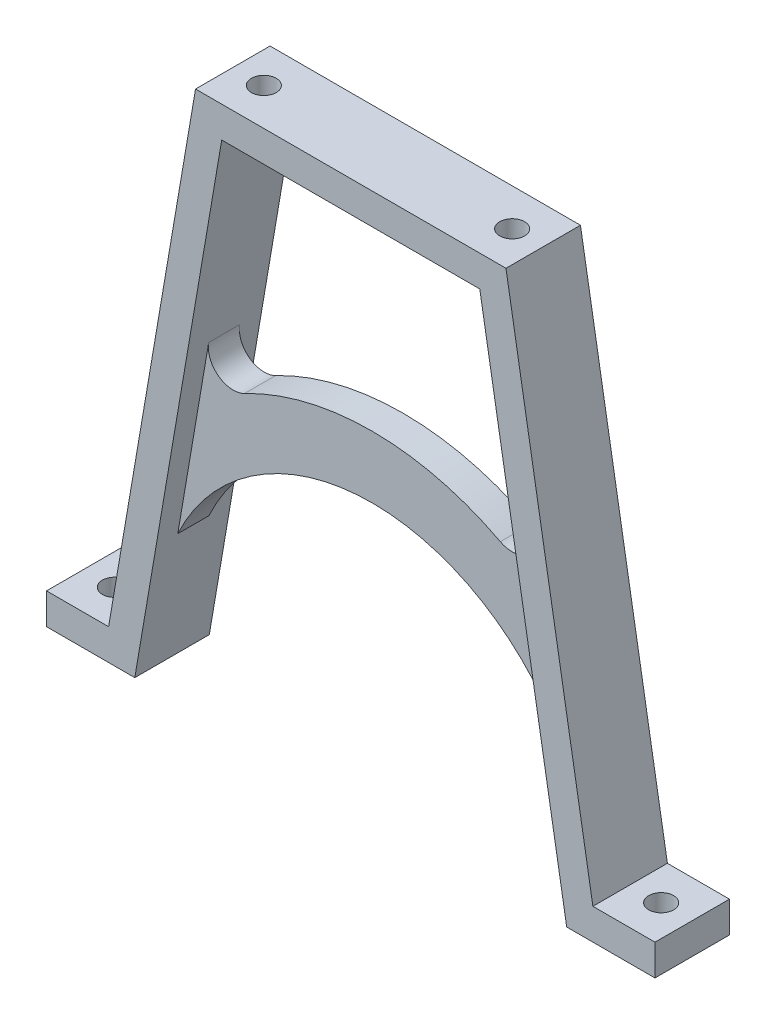
ISO-10303-21;
HEADER;
FILE_DESCRIPTION(('STEP AP214'),'2;1');
FILE_NAME('part.step','',(''),(''),'','','');
FILE_SCHEMA(('AUTOMOTIVE_DESIGN { 1 0 10303 214 1 1 1 1 }'));
ENDSEC;
DATA;
#1=APPLICATION_CONTEXT('core data for automotive mechanical design processes');
#2=APPLICATION_PROTOCOL_DEFINITION('international standard','automotive_design',2000,#1);
#3=PRODUCT_CONTEXT('',#1,'mechanical');
#4=PRODUCT('Part','Part','',(#3));
#5=PRODUCT_RELATED_PRODUCT_CATEGORY('part','',(#4));
#6=PRODUCT_DEFINITION_FORMATION('','',#4);
#7=PRODUCT_DEFINITION_CONTEXT('part definition',#1,'design');
#8=PRODUCT_DEFINITION('design','',#6,#7);
#9=PRODUCT_DEFINITION_SHAPE('','',#8);
#10=(LENGTH_UNIT() NAMED_UNIT(*) SI_UNIT(.MILLI.,.METRE.));
#11=(NAMED_UNIT(*) PLANE_ANGLE_UNIT() SI_UNIT($,.RADIAN.));
#12=(NAMED_UNIT(*) SI_UNIT($,.STERADIAN.) SOLID_ANGLE_UNIT());
#13=UNCERTAINTY_MEASURE_WITH_UNIT(LENGTH_MEASURE(1.E-05),#10,'distance_accuracy_value','');
#14=(GEOMETRIC_REPRESENTATION_CONTEXT(3) GLOBAL_UNCERTAINTY_ASSIGNED_CONTEXT((#13)) GLOBAL_UNIT_ASSIGNED_CONTEXT((#10,
#11,#12)) REPRESENTATION_CONTEXT('',''));
#15=CARTESIAN_POINT('',(0.,0.,0.));
#16=DIRECTION('',(0.,0.,1.));
#17=DIRECTION('',(1.,0.,0.));
#18=AXIS2_PLACEMENT_3D('',#15,#16,#17);
#19=CARTESIAN_POINT('',(-49.,5.,6.));
#20=DIRECTION('',(1.,0.,0.));
#21=DIRECTION('',(0.,0.,-1.));
#22=AXIS2_PLACEMENT_3D('',#19,#20,#21);
#23=PLANE('',#22);
#24=DIRECTION('',(0.,-1.,0.));
#25=VECTOR('',#24,1.);
#26=CARTESIAN_POINT('',(-49.,5.,-6.));
#27=LINE('',#26,#25);
#28=CARTESIAN_POINT('',(-49.,5.,-6.));
#29=VERTEX_POINT('',#28);
#30=CARTESIAN_POINT('',(-49.,0.,-6.));
#31=VERTEX_POINT('',#30);
#32=EDGE_CURVE('E257',#29,#31,#27,.T.);
#33=ORIENTED_EDGE('',*,*,#32,.T.);
#34=DIRECTION('',(0.,0.,-1.));
#35=VECTOR('',#34,1.);
#36=CARTESIAN_POINT('',(-49.,0.,6.));
#37=LINE('',#36,#35);
#38=CARTESIAN_POINT('',(-49.,0.,6.));
#39=VERTEX_POINT('',#38);
#40=EDGE_CURVE('E339',#39,#31,#37,.T.);
#41=ORIENTED_EDGE('',*,*,#40,.F.);
#42=DIRECTION('',(0.,-1.,0.));
#43=VECTOR('',#42,1.);
#44=CARTESIAN_POINT('',(-49.,5.,6.));
#45=LINE('',#44,#43);
#46=CARTESIAN_POINT('',(-49.,5.,6.));
#47=VERTEX_POINT('',#46);
#48=EDGE_CURVE('E235',#47,#39,#45,.T.);
#49=ORIENTED_EDGE('',*,*,#48,.F.);
#50=DIRECTION('',(0.,0.,-1.));
#51=VECTOR('',#50,1.);
#52=CARTESIAN_POINT('',(-49.,5.,6.));
#53=LINE('',#52,#51);
#54=EDGE_CURVE('E229',#47,#29,#53,.T.);
#55=ORIENTED_EDGE('',*,*,#54,.T.);
#56=EDGE_LOOP('',(#33,#41,#49,#55));
#57=FACE_BOUND('',#56,.T.);
#58=ADVANCED_FACE('F39',(#57),#23,.F.);
#59=CARTESIAN_POINT('',(-49.,0.,6.));
#60=DIRECTION('',(0.,1.,0.));
#61=DIRECTION('',(0.,0.,1.));
#62=AXIS2_PLACEMENT_3D('',#59,#60,#61);
#63=PLANE('',#62);
#64=CARTESIAN_POINT('',(-44.,0.,0.));
#65=DIRECTION('',(0.,1.,0.));
#66=DIRECTION('',(-1.,0.,0.));
#67=AXIS2_PLACEMENT_3D('',#64,#65,#66);
#68=CIRCLE('',#67,2.);
#69=CARTESIAN_POINT('',(-46.,0.,0.));
#70=VERTEX_POINT('',#69);
#71=EDGE_CURVE('E300',#70,#70,#68,.T.);
#72=ORIENTED_EDGE('',*,*,#71,.T.);
#73=EDGE_LOOP('',(#72));
#74=FACE_BOUND('',#73,.T.);
#75=DIRECTION('',(1.,0.,0.));
#76=VECTOR('',#75,1.);
#77=CARTESIAN_POINT('',(-49.,0.,-6.));
#78=LINE('',#77,#76);
#79=CARTESIAN_POINT('',(-34.7813086968084,0.,-6.));
#80=VERTEX_POINT('',#79);
#81=EDGE_CURVE('E255',#31,#80,#78,.T.);
#82=ORIENTED_EDGE('',*,*,#81,.T.);
#83=DIRECTION('',(0.,0.,-1.));
#84=VECTOR('',#83,1.);
#85=CARTESIAN_POINT('',(-34.7813086968084,0.,6.));
#86=LINE('',#85,#84);
#87=CARTESIAN_POINT('',(-34.7813086968084,0.,6.));
#88=VERTEX_POINT('',#87);
#89=EDGE_CURVE('E337',#88,#80,#86,.T.);
#90=ORIENTED_EDGE('',*,*,#89,.F.);
#91=DIRECTION('',(1.,0.,0.));
#92=VECTOR('',#91,1.);
#93=CARTESIAN_POINT('',(-49.,0.,6.));
#94=LINE('',#93,#92);
#95=EDGE_CURVE('E279',#39,#88,#94,.T.);
#96=ORIENTED_EDGE('',*,*,#95,.F.);
#97=ORIENTED_EDGE('',*,*,#40,.T.);
#98=EDGE_LOOP('',(#82,#90,#96,#97));
#99=FACE_BOUND('',#98,.T.);
#100=ADVANCED_FACE('F386',(#74,#99),#63,.F.);
#101=CARTESIAN_POINT('',(-34.7813086968084,0.,6.));
#102=DIRECTION('',(-0.985736425510407,0.168296462892021,0.));
#103=DIRECTION('',(-0.168296462892021,-0.985736425510407,0.));
#104=AXIS2_PLACEMENT_3D('',#101,#102,#103);
#105=PLANE('',#104);
#106=DIRECTION('',(0.,0.,-1.));
#107=VECTOR('',#106,1.);
#108=CARTESIAN_POINT('',(-26.3793209089771,49.2116427572976,6.));
#109=LINE('',#108,#107);
#110=CARTESIAN_POINT('',(-26.3793209089771,49.2116427572976,2.5));
#111=VERTEX_POINT('',#110);
#112=CARTESIAN_POINT('',(-26.3793209089771,49.2116427572976,-2.5));
#113=VERTEX_POINT('',#112);
#114=EDGE_CURVE('E352',#111,#113,#109,.T.);
#115=ORIENTED_EDGE('',*,*,#114,.T.);
#116=DIRECTION('',(0.168296462892021,0.985736425510407,0.));
#117=VECTOR('',#116,1.);
#118=CARTESIAN_POINT('',(-33.7961733637774,5.77007837918153,-2.5));
#119=LINE('',#118,#117);
#120=CARTESIAN_POINT('',(-31.357853441513,20.0516664953016,-2.5));
#121=VERTEX_POINT('',#120);
#122=EDGE_CURVE('E295',#121,#113,#119,.T.);
#123=ORIENTED_EDGE('',*,*,#122,.F.);
#124=DIRECTION('',(0.,0.,-1.));
#125=VECTOR('',#124,1.);
#126=CARTESIAN_POINT('',(-31.357853441513,20.0516664953016,2.5));
#127=LINE('',#126,#125);
#128=CARTESIAN_POINT('',(-31.357853441513,20.0516664953016,2.5));
#129=VERTEX_POINT('',#128);
#130=EDGE_CURVE('E260',#129,#121,#127,.T.);
#131=ORIENTED_EDGE('',*,*,#130,.F.);
#132=DIRECTION('',(0.168296462892021,0.985736425510407,0.));
#133=VECTOR('',#132,1.);
#134=CARTESIAN_POINT('',(-33.7961733637774,5.77007837918153,2.5));
#135=LINE('',#134,#133);
#136=EDGE_CURVE('E305',#129,#111,#135,.T.);
#137=ORIENTED_EDGE('',*,*,#136,.T.);
#138=EDGE_LOOP('',(#115,#123,#131,#137));
#139=FACE_BOUND('',#138,.T.);
#140=DIRECTION('',(0.168296462892021,0.985736425510407,0.));
#141=VECTOR('',#140,1.);
#142=CARTESIAN_POINT('',(-34.7813086968084,0.,-6.));
#143=LINE('',#142,#141);
#144=CARTESIAN_POINT('',(-20.7813086968084,82.,-6.));
#145=VERTEX_POINT('',#144);
#146=EDGE_CURVE('E252',#80,#145,#143,.T.);
#147=ORIENTED_EDGE('',*,*,#146,.T.);
#148=DIRECTION('',(0.,0.,-1.));
#149=VECTOR('',#148,1.);
#150=CARTESIAN_POINT('',(-20.7813086968084,82.,6.));
#151=LINE('',#150,#149);
#152=CARTESIAN_POINT('',(-20.7813086968084,82.,-1.84107488177192));
#153=VERTEX_POINT('',#152);
#154=EDGE_CURVE('E200',#153,#145,#151,.T.);
#155=ORIENTED_EDGE('',*,*,#154,.F.);
#156=CARTESIAN_POINT('',(-20.7813086968084,82.,1.84107488177192));
#157=VERTEX_POINT('',#156);
#158=EDGE_CURVE('E201',#157,#153,#151,.T.);
#159=ORIENTED_EDGE('',*,*,#158,.F.);
#160=CARTESIAN_POINT('',(-20.7813086968084,82.,6.));
#161=VERTEX_POINT('',#160);
#162=EDGE_CURVE('E203',#161,#157,#151,.T.);
#163=ORIENTED_EDGE('',*,*,#162,.F.);
#164=DIRECTION('',(0.168296462892021,0.985736425510407,0.));
#165=VECTOR('',#164,1.);
#166=CARTESIAN_POINT('',(-34.7813086968084,0.,6.));
#167=LINE('',#166,#165);
#168=EDGE_CURVE('E277',#88,#161,#167,.T.);
#169=ORIENTED_EDGE('',*,*,#168,.F.);
#170=ORIENTED_EDGE('',*,*,#89,.T.);
#171=EDGE_LOOP('',(#147,#155,#159,#163,#169,#170));
#172=FACE_BOUND('',#171,.T.);
#173=ADVANCED_FACE('F335',(#139,#172),#105,.F.);
#174=CARTESIAN_POINT('',(-20.7813086968084,82.,6.));
#175=DIRECTION('',(0.,1.,0.));
#176=DIRECTION('',(0.,0.,1.));
#177=AXIS2_PLACEMENT_3D('',#174,#175,#176);
#178=PLANE('',#177);
#179=ORIENTED_EDGE('',*,*,#162,.T.);
#180=CARTESIAN_POINT('',(-20.,82.,0.));
#181=DIRECTION('',(0.,1.,0.));
#182=DIRECTION('',(0.,0.,1.));
#183=AXIS2_PLACEMENT_3D('',#180,#181,#182);
#184=CIRCLE('',#183,2.);
#185=EDGE_CURVE('E323',#153,#157,#184,.F.);
#186=ORIENTED_EDGE('',*,*,#185,.F.);
#187=ORIENTED_EDGE('',*,*,#154,.T.);
#188=DIRECTION('',(1.,0.,0.));
#189=VECTOR('',#188,1.);
#190=CARTESIAN_POINT('',(-20.7813086968084,82.,-6.));
#191=LINE('',#190,#189);
#192=CARTESIAN_POINT('',(20.7813086968084,82.,-6.));
#193=VERTEX_POINT('',#192);
#194=EDGE_CURVE('E250',#145,#193,#191,.T.);
#195=ORIENTED_EDGE('',*,*,#194,.T.);
#196=DIRECTION('',(0.,0.,-1.));
#197=VECTOR('',#196,1.);
#198=CARTESIAN_POINT('',(20.7813086968084,82.,6.));
#199=LINE('',#198,#197);
#200=CARTESIAN_POINT('',(20.7813086968084,82.,-1.84107488177192));
#201=VERTEX_POINT('',#200);
#202=EDGE_CURVE('E179',#201,#193,#199,.T.);
#203=ORIENTED_EDGE('',*,*,#202,.F.);
#204=CARTESIAN_POINT('',(20.,82.,0.));
#205=DIRECTION('',(0.,1.,0.));
#206=DIRECTION('',(0.,0.,1.));
#207=AXIS2_PLACEMENT_3D('',#204,#205,#206);
#208=CIRCLE('',#207,2.);
#209=CARTESIAN_POINT('',(20.7813086968084,82.,1.84107488177192));
#210=VERTEX_POINT('',#209);
#211=EDGE_CURVE('E185',#210,#201,#208,.F.);
#212=ORIENTED_EDGE('',*,*,#211,.F.);
#213=CARTESIAN_POINT('',(20.7813086968084,82.,6.));
#214=VERTEX_POINT('',#213);
#215=EDGE_CURVE('E178',#214,#210,#199,.T.);
#216=ORIENTED_EDGE('',*,*,#215,.F.);
#217=DIRECTION('',(1.,0.,0.));
#218=VECTOR('',#217,1.);
#219=CARTESIAN_POINT('',(-20.7813086968084,82.,6.));
#220=LINE('',#219,#218);
#221=EDGE_CURVE('E275',#161,#214,#220,.T.);
#222=ORIENTED_EDGE('',*,*,#221,.F.);
#223=EDGE_LOOP('',(#179,#186,#187,#195,#203,#212,#216,#222));
#224=FACE_BOUND('',#223,.T.);
#225=ADVANCED_FACE('F192',(#224),#178,.F.);
#226=CARTESIAN_POINT('',(20.7813086968084,82.,6.));
#227=DIRECTION('',(0.985736425510407,0.168296462892021,0.));
#228=DIRECTION('',(-0.168296462892021,0.985736425510407,0.));
#229=AXIS2_PLACEMENT_3D('',#226,#227,#228);
#230=PLANE('',#229);
#231=DIRECTION('',(0.168296462892021,-0.985736425510407,0.));
#232=VECTOR('',#231,1.);
#233=CARTESIAN_POINT('',(33.7961733637775,5.77007837918155,-2.5));
#234=LINE('',#233,#232);
#235=CARTESIAN_POINT('',(26.3943588313549,49.1235634976568,-2.5));
#236=VERTEX_POINT('',#235);
#237=CARTESIAN_POINT('',(31.4502406347324,19.5105415064456,-2.5));
#238=VERTEX_POINT('',#237);
#239=EDGE_CURVE('E288',#236,#238,#234,.T.);
#240=ORIENTED_EDGE('',*,*,#239,.F.);
#241=DIRECTION('',(0.,0.,-1.));
#242=VECTOR('',#241,1.);
#243=CARTESIAN_POINT('',(26.3943588313549,49.1235634976568,6.));
#244=LINE('',#243,#242);
#245=CARTESIAN_POINT('',(26.3943588313549,49.1235634976568,2.5));
#246=VERTEX_POINT('',#245);
#247=EDGE_CURVE('E349',#236,#246,#244,.F.);
#248=ORIENTED_EDGE('',*,*,#247,.T.);
#249=DIRECTION('',(0.168296462892021,-0.985736425510407,0.));
#250=VECTOR('',#249,1.);
#251=CARTESIAN_POINT('',(33.7961733637775,5.77007837918155,2.5));
#252=LINE('',#251,#250);
#253=CARTESIAN_POINT('',(31.4502406347324,19.5105415064456,2.5));
#254=VERTEX_POINT('',#253);
#255=EDGE_CURVE('E287',#246,#254,#252,.T.);
#256=ORIENTED_EDGE('',*,*,#255,.T.);
#257=DIRECTION('',(0.,0.,-1.));
#258=VECTOR('',#257,1.);
#259=CARTESIAN_POINT('',(31.4502406347324,19.5105415064456,2.5));
#260=LINE('',#259,#258);
#261=EDGE_CURVE('E285',#254,#238,#260,.T.);
#262=ORIENTED_EDGE('',*,*,#261,.T.);
#263=EDGE_LOOP('',(#240,#248,#256,#262));
#264=FACE_BOUND('',#263,.T.);
#265=DIRECTION('',(0.168296462892021,-0.985736425510407,0.));
#266=VECTOR('',#265,1.);
#267=CARTESIAN_POINT('',(20.7813086968084,82.,-6.));
#268=LINE('',#267,#266);
#269=CARTESIAN_POINT('',(34.7813086968085,0.,-6.));
#270=VERTEX_POINT('',#269);
#271=EDGE_CURVE('E248',#193,#270,#268,.T.);
#272=ORIENTED_EDGE('',*,*,#271,.T.);
#273=DIRECTION('',(0.,0.,-1.));
#274=VECTOR('',#273,1.);
#275=CARTESIAN_POINT('',(34.7813086968085,0.,6.));
#276=LINE('',#275,#274);
#277=CARTESIAN_POINT('',(34.7813086968085,0.,6.));
#278=VERTEX_POINT('',#277);
#279=EDGE_CURVE('E205',#278,#270,#276,.T.);
#280=ORIENTED_EDGE('',*,*,#279,.F.);
#281=DIRECTION('',(0.168296462892021,-0.985736425510407,0.));
#282=VECTOR('',#281,1.);
#283=CARTESIAN_POINT('',(20.7813086968084,82.,6.));
#284=LINE('',#283,#282);
#285=EDGE_CURVE('E199',#214,#278,#284,.T.);
#286=ORIENTED_EDGE('',*,*,#285,.F.);
#287=ORIENTED_EDGE('',*,*,#215,.T.);
#288=EDGE_CURVE('E174',#210,#201,#199,.T.);
#289=ORIENTED_EDGE('',*,*,#288,.T.);
#290=ORIENTED_EDGE('',*,*,#202,.T.);
#291=EDGE_LOOP('',(#272,#280,#286,#287,#289,#290));
#292=FACE_BOUND('',#291,.T.);
#293=ADVANCED_FACE('F197',(#264,#292),#230,.F.);
#294=CARTESIAN_POINT('',(34.7813086968085,0.,6.));
#295=DIRECTION('',(0.,1.,0.));
#296=DIRECTION('',(0.,0.,1.));
#297=AXIS2_PLACEMENT_3D('',#294,#295,#296);
#298=PLANE('',#297);
#299=CARTESIAN_POINT('',(43.9999999999997,0.,0.));
#300=DIRECTION('',(0.,1.,0.));
#301=DIRECTION('',(-1.,0.,0.));
#302=AXIS2_PLACEMENT_3D('',#299,#300,#301);
#303=CIRCLE('',#302,2.);
#304=CARTESIAN_POINT('',(41.9999999999997,0.,0.));
#305=VERTEX_POINT('',#304);
#306=EDGE_CURVE('E312',#305,#305,#303,.T.);
#307=ORIENTED_EDGE('',*,*,#306,.T.);
#308=EDGE_LOOP('',(#307));
#309=FACE_BOUND('',#308,.T.);
#310=DIRECTION('',(1.,0.,0.));
#311=VECTOR('',#310,1.);
#312=CARTESIAN_POINT('',(34.7813086968085,0.,-6.));
#313=LINE('',#312,#311);
#314=CARTESIAN_POINT('',(49.0000000000001,0.,-6.));
#315=VERTEX_POINT('',#314);
#316=EDGE_CURVE('E246',#270,#315,#313,.T.);
#317=ORIENTED_EDGE('',*,*,#316,.T.);
#318=DIRECTION('',(0.,0.,-1.));
#319=VECTOR('',#318,1.);
#320=CARTESIAN_POINT('',(49.0000000000001,0.,6.));
#321=LINE('',#320,#319);
#322=CARTESIAN_POINT('',(49.0000000000001,0.,6.));
#323=VERTEX_POINT('',#322);
#324=EDGE_CURVE('E207',#323,#315,#321,.T.);
#325=ORIENTED_EDGE('',*,*,#324,.F.);
#326=DIRECTION('',(1.,0.,0.));
#327=VECTOR('',#326,1.);
#328=CARTESIAN_POINT('',(34.7813086968085,0.,6.));
#329=LINE('',#328,#327);
#330=EDGE_CURVE('E272',#278,#323,#329,.T.);
#331=ORIENTED_EDGE('',*,*,#330,.F.);
#332=ORIENTED_EDGE('',*,*,#279,.T.);
#333=EDGE_LOOP('',(#317,#325,#331,#332));
#334=FACE_BOUND('',#333,.T.);
#335=ADVANCED_FACE('F448',(#309,#334),#298,.F.);
#336=CARTESIAN_POINT('',(49.0000000000001,0.,6.));
#337=DIRECTION('',(-1.,0.,0.));
#338=DIRECTION('',(0.,-1.,0.));
#339=AXIS2_PLACEMENT_3D('',#336,#337,#338);
#340=PLANE('',#339);
#341=DIRECTION('',(0.,1.,0.));
#342=VECTOR('',#341,1.);
#343=CARTESIAN_POINT('',(49.0000000000001,0.,-6.));
#344=LINE('',#343,#342);
#345=CARTESIAN_POINT('',(48.9999999999997,5.00000000000001,-6.));
#346=VERTEX_POINT('',#345);
#347=EDGE_CURVE('E244',#315,#346,#344,.T.);
#348=ORIENTED_EDGE('',*,*,#347,.T.);
#349=DIRECTION('',(0.,0.,-1.));
#350=VECTOR('',#349,1.);
#351=CARTESIAN_POINT('',(48.9999999999997,5.00000000000001,6.));
#352=LINE('',#351,#350);
#353=CARTESIAN_POINT('',(48.9999999999997,5.00000000000001,6.));
#354=VERTEX_POINT('',#353);
#355=EDGE_CURVE('E212',#354,#346,#352,.T.);
#356=ORIENTED_EDGE('',*,*,#355,.F.);
#357=DIRECTION('',(0.,1.,0.));
#358=VECTOR('',#357,1.);
#359=CARTESIAN_POINT('',(49.0000000000001,0.,6.));
#360=LINE('',#359,#358);
#361=EDGE_CURVE('E270',#323,#354,#360,.T.);
#362=ORIENTED_EDGE('',*,*,#361,.F.);
#363=ORIENTED_EDGE('',*,*,#324,.T.);
#364=EDGE_LOOP('',(#348,#356,#362,#363));
#365=FACE_BOUND('',#364,.T.);
#366=ADVANCED_FACE('F444',(#365),#340,.F.);
#367=CARTESIAN_POINT('',(48.9999999999997,5.00000000000001,6.));
#368=DIRECTION('',(0.,-1.,0.));
#369=DIRECTION('',(0.,0.,-1.));
#370=AXIS2_PLACEMENT_3D('',#367,#368,#369);
#371=PLANE('',#370);
#372=CARTESIAN_POINT('',(43.9999999999997,5.00000000000002,0.));
#373=DIRECTION('',(0.,1.,0.));
#374=DIRECTION('',(-1.,0.,0.));
#375=AXIS2_PLACEMENT_3D('',#372,#373,#374);
#376=CIRCLE('',#375,2.);
#377=CARTESIAN_POINT('',(41.9999999999997,5.00000000000002,0.));
#378=VERTEX_POINT('',#377);
#379=EDGE_CURVE('E309',#378,#378,#376,.T.);
#380=ORIENTED_EDGE('',*,*,#379,.F.);
#381=EDGE_LOOP('',(#380));
#382=FACE_BOUND('',#381,.T.);
#383=DIRECTION('',(-1.,0.,0.));
#384=VECTOR('',#383,1.);
#385=CARTESIAN_POINT('',(48.9999999999997,5.00000000000001,-6.));
#386=LINE('',#385,#384);
#387=CARTESIAN_POINT('',(39.0000000000001,5.00000000000001,-6.));
#388=VERTEX_POINT('',#387);
#389=EDGE_CURVE('E242',#346,#388,#386,.T.);
#390=ORIENTED_EDGE('',*,*,#389,.T.);
#391=DIRECTION('',(0.,0.,-1.));
#392=VECTOR('',#391,1.);
#393=CARTESIAN_POINT('',(39.0000000000001,5.00000000000001,6.));
#394=LINE('',#393,#392);
#395=CARTESIAN_POINT('',(39.0000000000001,5.00000000000001,6.));
#396=VERTEX_POINT('',#395);
#397=EDGE_CURVE('E217',#396,#388,#394,.T.);
#398=ORIENTED_EDGE('',*,*,#397,.F.);
#399=DIRECTION('',(-1.,0.,0.));
#400=VECTOR('',#399,1.);
#401=CARTESIAN_POINT('',(48.9999999999997,5.00000000000001,6.));
#402=LINE('',#401,#400);
#403=EDGE_CURVE('E268',#354,#396,#402,.T.);
#404=ORIENTED_EDGE('',*,*,#403,.F.);
#405=ORIENTED_EDGE('',*,*,#355,.T.);
#406=EDGE_LOOP('',(#390,#398,#404,#405));
#407=FACE_BOUND('',#406,.T.);
#408=ADVANCED_FACE('F440',(#382,#407),#371,.F.);
#409=CARTESIAN_POINT('',(39.0000000000001,5.00000000000001,6.));
#410=DIRECTION('',(-0.985736425510407,-0.168296462892022,0.));
#411=DIRECTION('',(0.168296462892022,-0.985736425510407,0.));
#412=AXIS2_PLACEMENT_3D('',#409,#410,#411);
#413=PLANE('',#412);
#414=DIRECTION('',(-0.168296462892022,0.985736425510407,0.));
#415=VECTOR('',#414,1.);
#416=CARTESIAN_POINT('',(39.0000000000001,5.00000000000001,-6.));
#417=LINE('',#416,#415);
#418=CARTESIAN_POINT('',(25.,87.,-6.));
#419=VERTEX_POINT('',#418);
#420=EDGE_CURVE('E240',#388,#419,#417,.T.);
#421=ORIENTED_EDGE('',*,*,#420,.T.);
#422=DIRECTION('',(0.,0.,-1.));
#423=VECTOR('',#422,1.);
#424=CARTESIAN_POINT('',(25.,87.,6.));
#425=LINE('',#424,#423);
#426=CARTESIAN_POINT('',(25.,87.,6.));
#427=VERTEX_POINT('',#426);
#428=EDGE_CURVE('E220',#427,#419,#425,.T.);
#429=ORIENTED_EDGE('',*,*,#428,.F.);
#430=DIRECTION('',(-0.168296462892022,0.985736425510407,0.));
#431=VECTOR('',#430,1.);
#432=CARTESIAN_POINT('',(39.0000000000001,5.00000000000001,6.));
#433=LINE('',#432,#431);
#434=EDGE_CURVE('E266',#396,#427,#433,.T.);
#435=ORIENTED_EDGE('',*,*,#434,.F.);
#436=ORIENTED_EDGE('',*,*,#397,.T.);
#437=EDGE_LOOP('',(#421,#429,#435,#436));
#438=FACE_BOUND('',#437,.T.);
#439=ADVANCED_FACE('F436',(#438),#413,.F.);
#440=CARTESIAN_POINT('',(25.,87.,6.));
#441=DIRECTION('',(0.,-1.,0.));
#442=DIRECTION('',(0.,0.,-1.));
#443=AXIS2_PLACEMENT_3D('',#440,#441,#442);
#444=PLANE('',#443);
#445=CARTESIAN_POINT('',(-20.,87.,0.));
#446=DIRECTION('',(0.,1.,0.));
#447=DIRECTION('',(0.,0.,1.));
#448=AXIS2_PLACEMENT_3D('',#445,#446,#447);
#449=CIRCLE('',#448,2.);
#450=CARTESIAN_POINT('',(-20.,87.,2.));
#451=VERTEX_POINT('',#450);
#452=EDGE_CURVE('E187',#451,#451,#449,.T.);
#453=ORIENTED_EDGE('',*,*,#452,.F.);
#454=EDGE_LOOP('',(#453));
#455=FACE_BOUND('',#454,.T.);
#456=CARTESIAN_POINT('',(20.,87.,0.));
#457=DIRECTION('',(0.,1.,0.));
#458=DIRECTION('',(0.,0.,1.));
#459=AXIS2_PLACEMENT_3D('',#456,#457,#458);
#460=CIRCLE('',#459,2.);
#461=CARTESIAN_POINT('',(20.,87.,2.));
#462=VERTEX_POINT('',#461);
#463=EDGE_CURVE('E196',#462,#462,#460,.T.);
#464=ORIENTED_EDGE('',*,*,#463,.F.);
#465=EDGE_LOOP('',(#464));
#466=FACE_BOUND('',#465,.T.);
#467=DIRECTION('',(-1.,0.,0.));
#468=VECTOR('',#467,1.);
#469=CARTESIAN_POINT('',(25.,87.,-6.));
#470=LINE('',#469,#468);
#471=CARTESIAN_POINT('',(-25.,87.,-6.));
#472=VERTEX_POINT('',#471);
#473=EDGE_CURVE('E238',#419,#472,#470,.T.);
#474=ORIENTED_EDGE('',*,*,#473,.T.);
#475=DIRECTION('',(0.,0.,-1.));
#476=VECTOR('',#475,1.);
#477=CARTESIAN_POINT('',(-25.,87.,6.));
#478=LINE('',#477,#476);
#479=CARTESIAN_POINT('',(-25.,87.,6.));
#480=VERTEX_POINT('',#479);
#481=EDGE_CURVE('E223',#480,#472,#478,.T.);
#482=ORIENTED_EDGE('',*,*,#481,.F.);
#483=DIRECTION('',(-1.,0.,0.));
#484=VECTOR('',#483,1.);
#485=CARTESIAN_POINT('',(25.,87.,6.));
#486=LINE('',#485,#484);
#487=EDGE_CURVE('E264',#427,#480,#486,.T.);
#488=ORIENTED_EDGE('',*,*,#487,.F.);
#489=ORIENTED_EDGE('',*,*,#428,.T.);
#490=EDGE_LOOP('',(#474,#482,#488,#489));
#491=FACE_BOUND('',#490,.T.);
#492=ADVANCED_FACE('F432',(#455,#466,#491),#444,.F.);
#493=CARTESIAN_POINT('',(-25.,87.,6.));
#494=DIRECTION('',(0.985736425510407,-0.168296462892021,0.));
#495=DIRECTION('',(0.168296462892021,0.985736425510407,0.));
#496=AXIS2_PLACEMENT_3D('',#493,#494,#495);
#497=PLANE('',#496);
#498=DIRECTION('',(-0.168296462892021,-0.985736425510407,0.));
#499=VECTOR('',#498,1.);
#500=CARTESIAN_POINT('',(-25.,87.,-6.));
#501=LINE('',#500,#499);
#502=CARTESIAN_POINT('',(-39.,5.,-6.));
#503=VERTEX_POINT('',#502);
#504=EDGE_CURVE('E236',#472,#503,#501,.T.);
#505=ORIENTED_EDGE('',*,*,#504,.T.);
#506=DIRECTION('',(0.,0.,-1.));
#507=VECTOR('',#506,1.);
#508=CARTESIAN_POINT('',(-39.,5.,6.));
#509=LINE('',#508,#507);
#510=CARTESIAN_POINT('',(-39.,5.,6.));
#511=VERTEX_POINT('',#510);
#512=EDGE_CURVE('E226',#511,#503,#509,.T.);
#513=ORIENTED_EDGE('',*,*,#512,.F.);
#514=DIRECTION('',(-0.168296462892021,-0.985736425510407,0.));
#515=VECTOR('',#514,1.);
#516=CARTESIAN_POINT('',(-25.,87.,6.));
#517=LINE('',#516,#515);
#518=EDGE_CURVE('E262',#480,#511,#517,.T.);
#519=ORIENTED_EDGE('',*,*,#518,.F.);
#520=ORIENTED_EDGE('',*,*,#481,.T.);
#521=EDGE_LOOP('',(#505,#513,#519,#520));
#522=FACE_BOUND('',#521,.T.);
#523=ADVANCED_FACE('F428',(#522),#497,.F.);
#524=CARTESIAN_POINT('',(-39.,5.,6.));
#525=DIRECTION('',(0.,-1.,0.));
#526=DIRECTION('',(1.,0.,0.));
#527=AXIS2_PLACEMENT_3D('',#524,#525,#526);
#528=PLANE('',#527);
#529=CARTESIAN_POINT('',(-44.,5.,0.));
#530=DIRECTION('',(0.,1.,0.));
#531=DIRECTION('',(-1.,0.,0.));
#532=AXIS2_PLACEMENT_3D('',#529,#530,#531);
#533=CIRCLE('',#532,2.);
#534=CARTESIAN_POINT('',(-46.,5.,0.));
#535=VERTEX_POINT('',#534);
#536=EDGE_CURVE('E315',#535,#535,#533,.T.);
#537=ORIENTED_EDGE('',*,*,#536,.F.);
#538=EDGE_LOOP('',(#537));
#539=FACE_BOUND('',#538,.T.);
#540=DIRECTION('',(-1.,0.,0.));
#541=VECTOR('',#540,1.);
#542=CARTESIAN_POINT('',(-39.,5.,-6.));
#543=LINE('',#542,#541);
#544=EDGE_CURVE('E233',#503,#29,#543,.T.);
#545=ORIENTED_EDGE('',*,*,#544,.T.);
#546=ORIENTED_EDGE('',*,*,#54,.F.);
#547=DIRECTION('',(-1.,0.,0.));
#548=VECTOR('',#547,1.);
#549=CARTESIAN_POINT('',(-39.,5.,6.));
#550=LINE('',#549,#548);
#551=EDGE_CURVE('E232',#511,#47,#550,.T.);
#552=ORIENTED_EDGE('',*,*,#551,.F.);
#553=ORIENTED_EDGE('',*,*,#512,.T.);
#554=EDGE_LOOP('',(#545,#546,#552,#553));
#555=FACE_BOUND('',#554,.T.);
#556=ADVANCED_FACE('F421',(#539,#555),#528,.F.);
#557=CARTESIAN_POINT('',(0.,0.,6.));
#558=DIRECTION('',(0.,0.,1.));
#559=DIRECTION('',(1.,0.,0.));
#560=AXIS2_PLACEMENT_3D('',#557,#558,#559);
#561=PLANE('',#560);
#562=ORIENTED_EDGE('',*,*,#48,.T.);
#563=ORIENTED_EDGE('',*,*,#95,.T.);
#564=ORIENTED_EDGE('',*,*,#168,.T.);
#565=ORIENTED_EDGE('',*,*,#221,.T.);
#566=ORIENTED_EDGE('',*,*,#285,.T.);
#567=ORIENTED_EDGE('',*,*,#330,.T.);
#568=ORIENTED_EDGE('',*,*,#361,.T.);
#569=ORIENTED_EDGE('',*,*,#403,.T.);
#570=ORIENTED_EDGE('',*,*,#434,.T.);
#571=ORIENTED_EDGE('',*,*,#487,.T.);
#572=ORIENTED_EDGE('',*,*,#518,.T.);
#573=ORIENTED_EDGE('',*,*,#551,.T.);
#574=EDGE_LOOP('',(#562,#563,#564,#565,#566,#567,#568,#569,#570,#571,#572,#573));
#575=FACE_BOUND('',#574,.T.);
#576=ADVANCED_FACE('F418',(#575),#561,.T.);
#577=CARTESIAN_POINT('',(0.,0.,-6.));
#578=DIRECTION('',(0.,0.,1.));
#579=DIRECTION('',(1.,0.,0.));
#580=AXIS2_PLACEMENT_3D('',#577,#578,#579);
#581=PLANE('',#580);
#582=ORIENTED_EDGE('',*,*,#32,.F.);
#583=ORIENTED_EDGE('',*,*,#544,.F.);
#584=ORIENTED_EDGE('',*,*,#504,.F.);
#585=ORIENTED_EDGE('',*,*,#473,.F.);
#586=ORIENTED_EDGE('',*,*,#420,.F.);
#587=ORIENTED_EDGE('',*,*,#389,.F.);
#588=ORIENTED_EDGE('',*,*,#347,.F.);
#589=ORIENTED_EDGE('',*,*,#316,.F.);
#590=ORIENTED_EDGE('',*,*,#271,.F.);
#591=ORIENTED_EDGE('',*,*,#194,.F.);
#592=ORIENTED_EDGE('',*,*,#146,.F.);
#593=ORIENTED_EDGE('',*,*,#81,.F.);
#594=EDGE_LOOP('',(#582,#583,#584,#585,#586,#587,#588,#589,#590,#591,#592,#593));
#595=FACE_BOUND('',#594,.T.);
#596=ADVANCED_FACE('F417',(#595),#581,.F.);
#597=CARTESIAN_POINT('',(-0.0768449392107263,5.50008558191314,2.5));
#598=DIRECTION('',(0.,0.,-1.));
#599=DIRECTION('',(-1.,0.,0.));
#600=AXIS2_PLACEMENT_3D('',#597,#598,#599);
#601=CYLINDRICAL_SURFACE('',#600,44.5);
#602=CARTESIAN_POINT('',(-0.0768449392107263,5.50008558191314,2.5));
#603=DIRECTION('',(0.,0.,1.));
#604=DIRECTION('',(1.,0.,0.));
#605=AXIS2_PLACEMENT_3D('',#602,#603,#604);
#606=CIRCLE('',#605,44.5);
#607=CARTESIAN_POINT('',(-20.5922902364015,44.988900507889,2.5));
#608=VERTEX_POINT('',#607);
#609=CARTESIAN_POINT('',(20.593412463868,44.9080855170846,2.5));
#610=VERTEX_POINT('',#609);
#611=EDGE_CURVE('E291',#608,#610,#606,.F.);
#612=ORIENTED_EDGE('',*,*,#611,.T.);
#613=DIRECTION('',(0.,0.,-1.));
#614=VECTOR('',#613,1.);
#615=CARTESIAN_POINT('',(20.593412463868,44.9080855170846,2.5));
#616=LINE('',#615,#614);
#617=CARTESIAN_POINT('',(20.593412463868,44.9080855170846,-2.5));
#618=VERTEX_POINT('',#617);
#619=EDGE_CURVE('E346',#610,#618,#616,.T.);
#620=ORIENTED_EDGE('',*,*,#619,.T.);
#621=CARTESIAN_POINT('',(-0.0768449392107263,5.50008558191314,-2.5));
#622=DIRECTION('',(0.,0.,1.));
#623=DIRECTION('',(1.,0.,0.));
#624=AXIS2_PLACEMENT_3D('',#621,#622,#623);
#625=CIRCLE('',#624,44.5);
#626=CARTESIAN_POINT('',(-20.5922902364015,44.988900507889,-2.5));
#627=VERTEX_POINT('',#626);
#628=EDGE_CURVE('E297',#627,#618,#625,.F.);
#629=ORIENTED_EDGE('',*,*,#628,.F.);
#630=DIRECTION('',(0.,0.,-1.));
#631=VECTOR('',#630,1.);
#632=CARTESIAN_POINT('',(-20.5922902364015,44.988900507889,2.5));
#633=LINE('',#632,#631);
#634=EDGE_CURVE('E344',#627,#608,#633,.F.);
#635=ORIENTED_EDGE('',*,*,#634,.T.);
#636=EDGE_LOOP('',(#612,#620,#629,#635));
#637=FACE_BOUND('',#636,.T.);
#638=ADVANCED_FACE('F368',(#637),#601,.T.);
#639=CARTESIAN_POINT('',(-0.0768449392107263,5.50008558191314,2.5));
#640=DIRECTION('',(0.,0.,-1.));
#641=DIRECTION('',(-1.,0.,0.));
#642=AXIS2_PLACEMENT_3D('',#639,#640,#641);
#643=CYLINDRICAL_SURFACE('',#642,34.5);
#644=CARTESIAN_POINT('',(-0.0768449392107263,5.50008558191314,-2.5));
#645=DIRECTION('',(0.,0.,1.));
#646=DIRECTION('',(1.,0.,0.));
#647=AXIS2_PLACEMENT_3D('',#644,#645,#646);
#648=CIRCLE('',#647,34.5);
#649=EDGE_CURVE('E292',#121,#238,#648,.F.);
#650=ORIENTED_EDGE('',*,*,#649,.T.);
#651=ORIENTED_EDGE('',*,*,#261,.F.);
#652=CARTESIAN_POINT('',(-0.0768449392107263,5.50008558191314,2.5));
#653=DIRECTION('',(0.,0.,1.));
#654=DIRECTION('',(1.,0.,0.));
#655=AXIS2_PLACEMENT_3D('',#652,#653,#654);
#656=CIRCLE('',#655,34.5);
#657=EDGE_CURVE('E302',#129,#254,#656,.F.);
#658=ORIENTED_EDGE('',*,*,#657,.F.);
#659=ORIENTED_EDGE('',*,*,#130,.T.);
#660=EDGE_LOOP('',(#650,#651,#658,#659));
#661=FACE_BOUND('',#660,.T.);
#662=ADVANCED_FACE('F383',(#661),#643,.F.);
#663=CARTESIAN_POINT('',(0.,0.,2.5));
#664=DIRECTION('',(0.,0.,1.));
#665=DIRECTION('',(1.,0.,0.));
#666=AXIS2_PLACEMENT_3D('',#663,#664,#665);
#667=PLANE('',#666);
#668=ORIENTED_EDGE('',*,*,#611,.F.);
#669=CARTESIAN_POINT('',(-22.4363752069355,48.5384569057295,2.5));
#670=DIRECTION('',(0.,0.,1.));
#671=DIRECTION('',(1.,0.,0.));
#672=AXIS2_PLACEMENT_3D('',#669,#670,#671);
#673=CIRCLE('',#672,4.);
#674=EDGE_CURVE('E11',#608,#111,#673,.F.);
#675=ORIENTED_EDGE('',*,*,#674,.T.);
#676=ORIENTED_EDGE('',*,*,#136,.F.);
#677=ORIENTED_EDGE('',*,*,#657,.T.);
#678=ORIENTED_EDGE('',*,*,#255,.F.);
#679=CARTESIAN_POINT('',(22.4514131293132,48.4503776460887,2.5));
#680=DIRECTION('',(0.,0.,1.));
#681=DIRECTION('',(1.,0.,0.));
#682=AXIS2_PLACEMENT_3D('',#679,#680,#681);
#683=CIRCLE('',#682,4.);
#684=EDGE_CURVE('E358',#246,#610,#683,.F.);
#685=ORIENTED_EDGE('',*,*,#684,.T.);
#686=EDGE_LOOP('',(#668,#675,#676,#677,#678,#685));
#687=FACE_BOUND('',#686,.T.);
#688=ADVANCED_FACE('F374',(#687),#667,.T.);
#689=CARTESIAN_POINT('',(0.,0.,-2.5));
#690=DIRECTION('',(0.,0.,1.));
#691=DIRECTION('',(1.,0.,0.));
#692=AXIS2_PLACEMENT_3D('',#689,#690,#691);
#693=PLANE('',#692);
#694=ORIENTED_EDGE('',*,*,#122,.T.);
#695=CARTESIAN_POINT('',(-22.4363752069355,48.5384569057295,-2.5));
#696=DIRECTION('',(0.,0.,1.));
#697=DIRECTION('',(1.,0.,0.));
#698=AXIS2_PLACEMENT_3D('',#695,#696,#697);
#699=CIRCLE('',#698,4.);
#700=EDGE_CURVE('E47',#113,#627,#699,.T.);
#701=ORIENTED_EDGE('',*,*,#700,.T.);
#702=ORIENTED_EDGE('',*,*,#628,.T.);
#703=CARTESIAN_POINT('',(22.4514131293132,48.4503776460887,-2.5));
#704=DIRECTION('',(0.,0.,1.));
#705=DIRECTION('',(1.,0.,0.));
#706=AXIS2_PLACEMENT_3D('',#703,#704,#705);
#707=CIRCLE('',#706,4.);
#708=EDGE_CURVE('E355',#618,#236,#707,.T.);
#709=ORIENTED_EDGE('',*,*,#708,.T.);
#710=ORIENTED_EDGE('',*,*,#239,.T.);
#711=ORIENTED_EDGE('',*,*,#649,.F.);
#712=EDGE_LOOP('',(#694,#701,#702,#709,#710,#711));
#713=FACE_BOUND('',#712,.T.);
#714=ADVANCED_FACE('F362',(#713),#693,.F.);
#715=CARTESIAN_POINT('',(22.4514131293132,48.4503776460887,2.5));
#716=DIRECTION('',(0.,0.,-1.));
#717=DIRECTION('',(-1.,0.,0.));
#718=AXIS2_PLACEMENT_3D('',#715,#716,#717);
#719=CYLINDRICAL_SURFACE('',#718,4.);
#720=ORIENTED_EDGE('',*,*,#684,.F.);
#721=ORIENTED_EDGE('',*,*,#247,.F.);
#722=ORIENTED_EDGE('',*,*,#708,.F.);
#723=ORIENTED_EDGE('',*,*,#619,.F.);
#724=EDGE_LOOP('',(#720,#721,#722,#723));
#725=FACE_BOUND('',#724,.T.);
#726=ADVANCED_FACE('F377',(#725),#719,.F.);
#727=CARTESIAN_POINT('',(-22.4363752069355,48.5384569057295,2.5));
#728=DIRECTION('',(0.,0.,-1.));
#729=DIRECTION('',(-1.,0.,0.));
#730=AXIS2_PLACEMENT_3D('',#727,#728,#729);
#731=CYLINDRICAL_SURFACE('',#730,4.);
#732=ORIENTED_EDGE('',*,*,#674,.F.);
#733=ORIENTED_EDGE('',*,*,#634,.F.);
#734=ORIENTED_EDGE('',*,*,#700,.F.);
#735=ORIENTED_EDGE('',*,*,#114,.F.);
#736=EDGE_LOOP('',(#732,#733,#734,#735));
#737=FACE_BOUND('',#736,.T.);
#738=ADVANCED_FACE('F41',(#737),#731,.F.);
#739=CARTESIAN_POINT('',(-44.,0.,0.));
#740=DIRECTION('',(0.,1.,0.));
#741=DIRECTION('',(-1.,0.,0.));
#742=AXIS2_PLACEMENT_3D('',#739,#740,#741);
#743=CYLINDRICAL_SURFACE('',#742,2.);
#744=CARTESIAN_POINT('',(-46.,0.,0.));
#745=CARTESIAN_POINT('',(-46.,0.0520833333333167,0.));
#746=CARTESIAN_POINT('',(-46.,0.10416666666665,0.));
#747=CARTESIAN_POINT('',(-46.,0.208333333333317,0.));
#748=CARTESIAN_POINT('',(-46.,0.260416666666651,0.));
#749=CARTESIAN_POINT('',(-46.,0.364583333333318,0.));
#750=CARTESIAN_POINT('',(-46.,0.416666666666651,0.));
#751=CARTESIAN_POINT('',(-46.,0.520833333333318,0.));
#752=CARTESIAN_POINT('',(-46.,0.572916666666652,0.));
#753=CARTESIAN_POINT('',(-46.,0.677083333333319,0.));
#754=CARTESIAN_POINT('',(-46.,0.729166666666652,0.));
#755=CARTESIAN_POINT('',(-46.,0.833333333333319,0.));
#756=CARTESIAN_POINT('',(-46.,0.885416666666653,0.));
#757=CARTESIAN_POINT('',(-46.,0.98958333333332,0.));
#758=CARTESIAN_POINT('',(-46.,1.04166666666665,0.));
#759=CARTESIAN_POINT('',(-46.,1.14583333333332,0.));
#760=CARTESIAN_POINT('',(-46.,1.19791666666665,0.));
#761=CARTESIAN_POINT('',(-46.,1.30208333333332,0.));
#762=CARTESIAN_POINT('',(-46.,1.35416666666665,0.));
#763=CARTESIAN_POINT('',(-46.,1.45833333333332,0.));
#764=CARTESIAN_POINT('',(-46.,1.51041666666666,0.));
#765=CARTESIAN_POINT('',(-46.,1.61458333333332,0.));
#766=CARTESIAN_POINT('',(-46.,1.66666666666666,0.));
#767=CARTESIAN_POINT('',(-46.,1.77083333333332,0.));
#768=CARTESIAN_POINT('',(-46.,1.82291666666666,0.));
#769=CARTESIAN_POINT('',(-46.,1.92708333333332,0.));
#770=CARTESIAN_POINT('',(-46.,1.97916666666666,0.));
#771=CARTESIAN_POINT('',(-46.,2.08333333333332,0.));
#772=CARTESIAN_POINT('',(-46.,2.13541666666666,0.));
#773=CARTESIAN_POINT('',(-46.,2.23958333333332,0.));
#774=CARTESIAN_POINT('',(-46.,2.29166666666666,0.));
#775=CARTESIAN_POINT('',(-46.,2.39583333333333,0.));
#776=CARTESIAN_POINT('',(-46.,2.44791666666666,0.));
#777=CARTESIAN_POINT('',(-46.,2.55208333333333,0.));
#778=CARTESIAN_POINT('',(-46.,2.60416666666666,0.));
#779=CARTESIAN_POINT('',(-46.,2.70833333333333,0.));
#780=CARTESIAN_POINT('',(-46.,2.76041666666666,0.));
#781=CARTESIAN_POINT('',(-46.,2.86458333333333,0.));
#782=CARTESIAN_POINT('',(-46.,2.91666666666666,0.));
#783=CARTESIAN_POINT('',(-46.,3.02083333333333,0.));
#784=CARTESIAN_POINT('',(-46.,3.07291666666666,0.));
#785=CARTESIAN_POINT('',(-46.,3.17708333333333,0.));
#786=CARTESIAN_POINT('',(-46.,3.22916666666666,0.));
#787=CARTESIAN_POINT('',(-46.,3.33333333333333,0.));
#788=CARTESIAN_POINT('',(-46.,3.38541666666666,0.));
#789=CARTESIAN_POINT('',(-46.,3.48958333333333,0.));
#790=CARTESIAN_POINT('',(-46.,3.54166666666666,0.));
#791=CARTESIAN_POINT('',(-46.,3.64583333333333,0.));
#792=CARTESIAN_POINT('',(-46.,3.69791666666666,0.));
#793=CARTESIAN_POINT('',(-46.,3.80208333333333,0.));
#794=CARTESIAN_POINT('',(-46.,3.85416666666666,0.));
#795=CARTESIAN_POINT('',(-46.,3.95833333333333,0.));
#796=CARTESIAN_POINT('',(-46.,4.01041666666666,0.));
#797=CARTESIAN_POINT('',(-46.,4.11458333333333,0.));
#798=CARTESIAN_POINT('',(-46.,4.16666666666667,0.));
#799=CARTESIAN_POINT('',(-46.,4.27083333333333,0.));
#800=CARTESIAN_POINT('',(-46.,4.32291666666667,0.));
#801=CARTESIAN_POINT('',(-46.,4.42708333333333,0.));
#802=CARTESIAN_POINT('',(-46.,4.47916666666667,0.));
#803=CARTESIAN_POINT('',(-46.,4.58333333333333,0.));
#804=CARTESIAN_POINT('',(-46.,4.63541666666667,0.));
#805=CARTESIAN_POINT('',(-46.,4.73958333333333,0.));
#806=CARTESIAN_POINT('',(-46.,4.79166666666667,0.));
#807=CARTESIAN_POINT('',(-46.,4.89583333333333,0.));
#808=CARTESIAN_POINT('',(-46.,4.94791666666667,0.));
#809=CARTESIAN_POINT('',(-46.,5.,0.));
#810=B_SPLINE_CURVE_WITH_KNOTS('',3,(#744,#745,#746,#747,#748,#749,#750,#751,#752,#753,#754,
#755,#756,#757,#758,#759,#760,#761,#762,#763,#764,#765,#766,#767,#768,#769,#770,#771,#772,#773,
#774,#775,#776,#777,#778,#779,#780,#781,#782,#783,#784,#785,#786,#787,#788,#789,#790,#791,#792,
#793,#794,#795,#796,#797,#798,#799,#800,#801,#802,#803,#804,#805,#806,#807,#808,#809),
.UNSPECIFIED.,.F.,.F.,(4,2,2,2,2,2,2,2,2,2,2,2,2,2,2,2,2,2,2,2,2,2,2,2,2,2,2,2,2,2,2,2,4),(0.,
0.156250000000001,0.312500000000001,0.468750000000002,0.625000000000002,0.781250000000003,
0.937500000000003,1.09375,1.25,1.40625,1.56250000000001,1.71875000000001,1.87500000000001,
2.03125000000001,2.18750000000001,2.34375000000001,2.50000000000001,2.65625000000001,
2.81250000000001,2.96875000000001,3.12500000000001,3.28125000000001,3.43750000000001,
3.59375000000001,3.75000000000001,3.90625000000001,4.06250000000001,4.21875000000002,
4.37500000000002,4.53125000000002,4.68750000000002,4.84375000000002,5.00000000000002),.UNSPECIFIED.);
#811=EDGE_CURVE('BSEAM405',#70,#535,#810,.T.);
#812=ORIENTED_EDGE('',*,*,#71,.F.);
#813=ORIENTED_EDGE('',*,*,#536,.T.);
#814=ORIENTED_EDGE('',*,*,#811,.T.);
#815=ORIENTED_EDGE('',*,*,#811,.F.);
#816=EDGE_LOOP('',(#812,#814,#813,#815));
#817=FACE_BOUND('',#816,.T.);
#818=ADVANCED_FACE('F405',(#817),#743,.F.);
#819=CARTESIAN_POINT('',(43.9999999999997,0.,0.));
#820=DIRECTION('',(0.,1.,0.));
#821=DIRECTION('',(-1.,0.,0.));
#822=AXIS2_PLACEMENT_3D('',#819,#820,#821);
#823=CYLINDRICAL_SURFACE('',#822,2.);
#824=CARTESIAN_POINT('',(41.9999999999997,0.,0.));
#825=CARTESIAN_POINT('',(41.9999999999997,0.0520833333333323,0.));
#826=CARTESIAN_POINT('',(41.9999999999997,0.104166666666666,0.));
#827=CARTESIAN_POINT('',(41.9999999999997,0.208333333333333,0.));
#828=CARTESIAN_POINT('',(41.9999999999997,0.260416666666666,0.));
#829=CARTESIAN_POINT('',(41.9999999999997,0.364583333333333,0.));
#830=CARTESIAN_POINT('',(41.9999999999997,0.416666666666667,0.));
#831=CARTESIAN_POINT('',(41.9999999999997,0.520833333333334,0.));
#832=CARTESIAN_POINT('',(41.9999999999997,0.572916666666668,0.));
#833=CARTESIAN_POINT('',(41.9999999999997,0.677083333333335,0.));
#834=CARTESIAN_POINT('',(41.9999999999997,0.729166666666668,0.));
#835=CARTESIAN_POINT('',(41.9999999999997,0.833333333333335,0.));
#836=CARTESIAN_POINT('',(41.9999999999997,0.885416666666669,0.));
#837=CARTESIAN_POINT('',(41.9999999999997,0.989583333333336,0.));
#838=CARTESIAN_POINT('',(41.9999999999997,1.04166666666667,0.));
#839=CARTESIAN_POINT('',(41.9999999999997,1.14583333333334,0.));
#840=CARTESIAN_POINT('',(41.9999999999997,1.19791666666667,0.));
#841=CARTESIAN_POINT('',(41.9999999999997,1.30208333333334,0.));
#842=CARTESIAN_POINT('',(41.9999999999997,1.35416666666667,0.));
#843=CARTESIAN_POINT('',(41.9999999999997,1.45833333333334,0.));
#844=CARTESIAN_POINT('',(41.9999999999997,1.51041666666667,0.));
#845=CARTESIAN_POINT('',(41.9999999999997,1.61458333333334,0.));
#846=CARTESIAN_POINT('',(41.9999999999997,1.66666666666667,0.));
#847=CARTESIAN_POINT('',(41.9999999999997,1.77083333333334,0.));
#848=CARTESIAN_POINT('',(41.9999999999997,1.82291666666667,0.));
#849=CARTESIAN_POINT('',(41.9999999999997,1.92708333333334,0.));
#850=CARTESIAN_POINT('',(41.9999999999997,1.97916666666667,0.));
#851=CARTESIAN_POINT('',(41.9999999999997,2.08333333333334,0.));
#852=CARTESIAN_POINT('',(41.9999999999997,2.13541666666667,0.));
#853=CARTESIAN_POINT('',(41.9999999999997,2.23958333333334,0.));
#854=CARTESIAN_POINT('',(41.9999999999997,2.29166666666667,0.));
#855=CARTESIAN_POINT('',(41.9999999999997,2.39583333333334,0.));
#856=CARTESIAN_POINT('',(41.9999999999997,2.44791666666667,0.));
#857=CARTESIAN_POINT('',(41.9999999999997,2.55208333333334,0.));
#858=CARTESIAN_POINT('',(41.9999999999997,2.60416666666667,0.));
#859=CARTESIAN_POINT('',(41.9999999999997,2.70833333333334,0.));
#860=CARTESIAN_POINT('',(41.9999999999997,2.76041666666667,0.));
#861=CARTESIAN_POINT('',(41.9999999999997,2.86458333333334,0.));
#862=CARTESIAN_POINT('',(41.9999999999997,2.91666666666668,0.));
#863=CARTESIAN_POINT('',(41.9999999999997,3.02083333333334,0.));
#864=CARTESIAN_POINT('',(41.9999999999997,3.07291666666668,0.));
#865=CARTESIAN_POINT('',(41.9999999999997,3.17708333333334,0.));
#866=CARTESIAN_POINT('',(41.9999999999997,3.22916666666668,0.));
#867=CARTESIAN_POINT('',(41.9999999999997,3.33333333333334,0.));
#868=CARTESIAN_POINT('',(41.9999999999997,3.38541666666668,0.));
#869=CARTESIAN_POINT('',(41.9999999999997,3.48958333333334,0.));
#870=CARTESIAN_POINT('',(41.9999999999997,3.54166666666668,0.));
#871=CARTESIAN_POINT('',(41.9999999999997,3.64583333333335,0.));
#872=CARTESIAN_POINT('',(41.9999999999997,3.69791666666668,0.));
#873=CARTESIAN_POINT('',(41.9999999999997,3.80208333333335,0.));
#874=CARTESIAN_POINT('',(41.9999999999997,3.85416666666668,0.));
#875=CARTESIAN_POINT('',(41.9999999999997,3.95833333333335,0.));
#876=CARTESIAN_POINT('',(41.9999999999997,4.01041666666668,0.));
#877=CARTESIAN_POINT('',(41.9999999999997,4.11458333333335,0.));
#878=CARTESIAN_POINT('',(41.9999999999997,4.16666666666668,0.));
#879=CARTESIAN_POINT('',(41.9999999999997,4.27083333333335,0.));
#880=CARTESIAN_POINT('',(41.9999999999997,4.32291666666668,0.));
#881=CARTESIAN_POINT('',(41.9999999999997,4.42708333333335,0.));
#882=CARTESIAN_POINT('',(41.9999999999997,4.47916666666668,0.));
#883=CARTESIAN_POINT('',(41.9999999999997,4.58333333333335,0.));
#884=CARTESIAN_POINT('',(41.9999999999997,4.63541666666668,0.));
#885=CARTESIAN_POINT('',(41.9999999999997,4.73958333333335,0.));
#886=CARTESIAN_POINT('',(41.9999999999997,4.79166666666668,0.));
#887=CARTESIAN_POINT('',(41.9999999999997,4.89583333333335,0.));
#888=CARTESIAN_POINT('',(41.9999999999997,4.94791666666668,0.));
#889=CARTESIAN_POINT('',(41.9999999999997,5.00000000000002,0.));
#890=B_SPLINE_CURVE_WITH_KNOTS('',3,(#824,#825,#826,#827,#828,#829,#830,#831,#832,#833,#834,
#835,#836,#837,#838,#839,#840,#841,#842,#843,#844,#845,#846,#847,#848,#849,#850,#851,#852,#853,
#854,#855,#856,#857,#858,#859,#860,#861,#862,#863,#864,#865,#866,#867,#868,#869,#870,#871,#872,
#873,#874,#875,#876,#877,#878,#879,#880,#881,#882,#883,#884,#885,#886,#887,#888,#889),
.UNSPECIFIED.,.F.,.F.,(4,2,2,2,2,2,2,2,2,2,2,2,2,2,2,2,2,2,2,2,2,2,2,2,2,2,2,2,2,2,2,2,4),(0.,
0.156250000000001,0.312500000000001,0.468750000000002,0.625000000000002,0.781250000000003,
0.937500000000003,1.09375,1.25,1.40625,1.56250000000001,1.71875000000001,1.87500000000001,
2.03125000000001,2.18750000000001,2.34375000000001,2.50000000000001,2.65625000000001,
2.81250000000001,2.96875000000001,3.12500000000001,3.28125000000001,3.43750000000001,
3.59375000000001,3.75000000000001,3.90625000000001,4.06250000000002,4.21875000000002,
4.37500000000002,4.53125000000002,4.68750000000002,4.84375000000002,5.00000000000002),.UNSPECIFIED.);
#891=EDGE_CURVE('BSEAM570',#305,#378,#890,.T.);
#892=ORIENTED_EDGE('',*,*,#306,.F.);
#893=ORIENTED_EDGE('',*,*,#379,.T.);
#894=ORIENTED_EDGE('',*,*,#891,.T.);
#895=ORIENTED_EDGE('',*,*,#891,.F.);
#896=EDGE_LOOP('',(#892,#894,#893,#895));
#897=FACE_BOUND('',#896,.T.);
#898=ADVANCED_FACE('F570',(#897),#823,.F.);
#899=CARTESIAN_POINT('',(-20.7813086968084,82.,6.));
#900=DIRECTION('',(0.,1.,0.));
#901=DIRECTION('',(0.,0.,1.));
#902=AXIS2_PLACEMENT_3D('',#899,#900,#901);
#903=PLANE('',#902);
#904=ORIENTED_EDGE('',*,*,#288,.F.);
#905=EDGE_CURVE('E60',#201,#210,#208,.F.);
#906=ORIENTED_EDGE('',*,*,#905,.F.);
#907=EDGE_LOOP('',(#904,#906));
#908=FACE_BOUND('',#907,.T.);
#909=ADVANCED_FACE('F175',(#908),#903,.T.);
#910=CARTESIAN_POINT('',(20.,76.3431457505076,0.));
#911=DIRECTION('',(0.,1.,0.));
#912=DIRECTION('',(0.,0.,1.));
#913=AXIS2_PLACEMENT_3D('',#910,#911,#912);
#914=CYLINDRICAL_SURFACE('',#913,2.);
#915=ORIENTED_EDGE('',*,*,#905,.T.);
#916=ORIENTED_EDGE('',*,*,#211,.T.);
#917=EDGE_LOOP('',(#915,#916));
#918=FACE_BOUND('',#917,.T.);
#919=ORIENTED_EDGE('',*,*,#463,.T.);
#920=EDGE_LOOP('',(#919));
#921=FACE_BOUND('',#920,.T.);
#922=ADVANCED_FACE('F183',(#918,#921),#914,.F.);
#923=CARTESIAN_POINT('',(-20.7813086968084,82.,6.));
#924=DIRECTION('',(0.,1.,0.));
#925=DIRECTION('',(0.,0.,1.));
#926=AXIS2_PLACEMENT_3D('',#923,#924,#925);
#927=PLANE('',#926);
#928=ORIENTED_EDGE('',*,*,#158,.T.);
#929=EDGE_CURVE('E53',#157,#153,#184,.F.);
#930=ORIENTED_EDGE('',*,*,#929,.F.);
#931=EDGE_LOOP('',(#928,#930));
#932=FACE_BOUND('',#931,.T.);
#933=ADVANCED_FACE('F332',(#932),#927,.T.);
#934=CARTESIAN_POINT('',(-20.,76.3431457505076,0.));
#935=DIRECTION('',(0.,1.,0.));
#936=DIRECTION('',(0.,0.,1.));
#937=AXIS2_PLACEMENT_3D('',#934,#935,#936);
#938=CYLINDRICAL_SURFACE('',#937,2.);
#939=ORIENTED_EDGE('',*,*,#929,.T.);
#940=ORIENTED_EDGE('',*,*,#185,.T.);
#941=EDGE_LOOP('',(#939,#940));
#942=FACE_BOUND('',#941,.T.);
#943=ORIENTED_EDGE('',*,*,#452,.T.);
#944=EDGE_LOOP('',(#943));
#945=FACE_BOUND('',#944,.T.);
#946=ADVANCED_FACE('F328',(#942,#945),#938,.F.);
#947=CLOSED_SHELL('',(#58,#100,#173,#225,#293,#335,#366,#408,#439,#492,#523,#556,#576,#596,#638,
#662,#688,#714,#726,#738,#818,#898,#909,#922,#933,#946));
#948=MANIFOLD_SOLID_BREP('B2',#947);
#949=ADVANCED_BREP_SHAPE_REPRESENTATION('',(#18,#948),#14);
#950=SHAPE_DEFINITION_REPRESENTATION(#9,#949);
ENDSEC;
END-ISO-10303-21;
